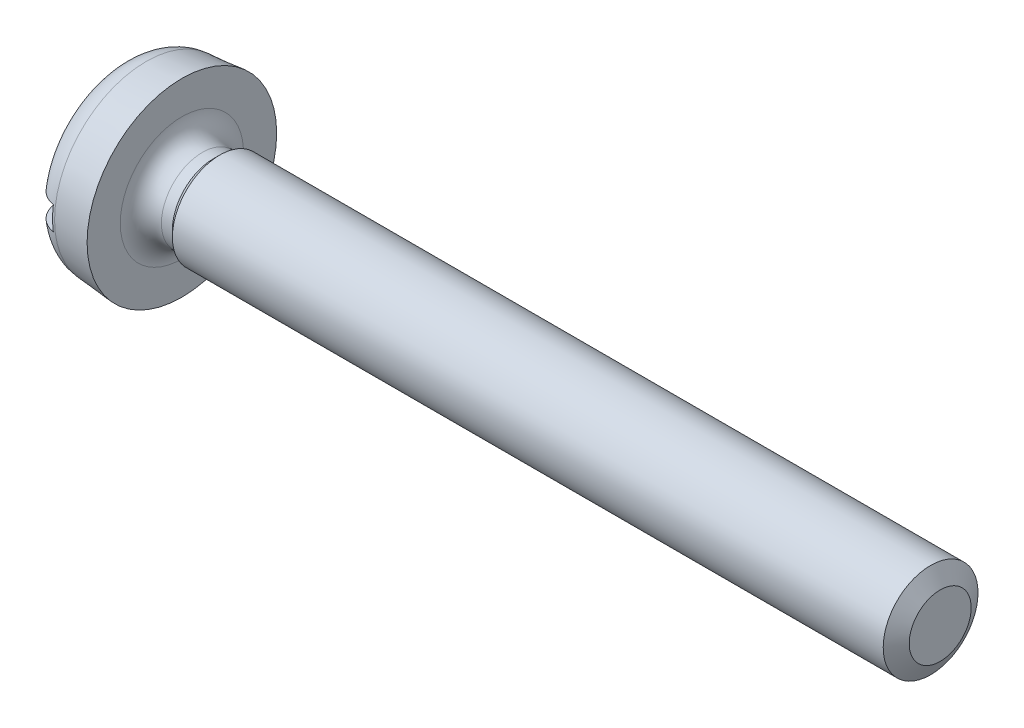
ISO-10303-21;
HEADER;
FILE_DESCRIPTION(('STEP AP214'),'2;1');
FILE_NAME('part.step','',(''),(''),'','','');
FILE_SCHEMA(('AUTOMOTIVE_DESIGN { 1 0 10303 214 1 1 1 1 }'));
ENDSEC;
DATA;
#1=APPLICATION_CONTEXT('core data for automotive mechanical design processes');
#2=APPLICATION_PROTOCOL_DEFINITION('international standard','automotive_design',2000,#1);
#3=PRODUCT_CONTEXT('',#1,'mechanical');
#4=PRODUCT('Part','Part','',(#3));
#5=PRODUCT_RELATED_PRODUCT_CATEGORY('part','',(#4));
#6=PRODUCT_DEFINITION_FORMATION('','',#4);
#7=PRODUCT_DEFINITION_CONTEXT('part definition',#1,'design');
#8=PRODUCT_DEFINITION('design','',#6,#7);
#9=PRODUCT_DEFINITION_SHAPE('','',#8);
#10=(LENGTH_UNIT() NAMED_UNIT(*) SI_UNIT(.MILLI.,.METRE.));
#11=(NAMED_UNIT(*) PLANE_ANGLE_UNIT() SI_UNIT($,.RADIAN.));
#12=(NAMED_UNIT(*) SI_UNIT($,.STERADIAN.) SOLID_ANGLE_UNIT());
#13=UNCERTAINTY_MEASURE_WITH_UNIT(LENGTH_MEASURE(1.E-05),#10,'distance_accuracy_value','');
#14=(GEOMETRIC_REPRESENTATION_CONTEXT(3) GLOBAL_UNCERTAINTY_ASSIGNED_CONTEXT((#13)) GLOBAL_UNIT_ASSIGNED_CONTEXT((#10,
#11,#12)) REPRESENTATION_CONTEXT('',''));
#15=CARTESIAN_POINT('',(0.,0.,0.));
#16=DIRECTION('',(0.,0.,1.));
#17=DIRECTION('',(1.,0.,0.));
#18=AXIS2_PLACEMENT_3D('',#15,#16,#17);
#19=CARTESIAN_POINT('',(0.,1.33646603300585,0.));
#20=DIRECTION('',(1.,0.,0.));
#21=DIRECTION('',(0.,0.,-1.));
#22=AXIS2_PLACEMENT_3D('',#19,#20,#21);
#23=PLANE('',#22);
#24=CARTESIAN_POINT('',(0.,0.,0.));
#25=DIRECTION('',(-1.,0.,0.));
#26=DIRECTION('',(0.,0.,1.));
#27=AXIS2_PLACEMENT_3D('',#24,#25,#26);
#28=CIRCLE('',#27,1.33646603300585);
#29=CARTESIAN_POINT('',(0.,0.25,1.31287526345877));
#30=VERTEX_POINT('',#29);
#31=CARTESIAN_POINT('',(0.,0.25,-1.31287526344982));
#32=VERTEX_POINT('',#31);
#33=EDGE_CURVE('E102',#30,#32,#28,.T.);
#34=ORIENTED_EDGE('',*,*,#33,.T.);
#35=DIRECTION('',(0.,0.,1.));
#36=VECTOR('',#35,1.);
#37=CARTESIAN_POINT('',(0.,0.25,-50.));
#38=LINE('',#37,#36);
#39=EDGE_CURVE('E155',#32,#30,#38,.T.);
#40=ORIENTED_EDGE('',*,*,#39,.T.);
#41=EDGE_LOOP('',(#34,#40));
#42=FACE_BOUND('',#41,.T.);
#43=ADVANCED_FACE('F41',(#42),#23,.F.);
#44=CARTESIAN_POINT('',(0.,-0.25,-1.31287526346165));
#45=VERTEX_POINT('',#44);
#46=CARTESIAN_POINT('',(0.,-0.25,1.3128752634498));
#47=VERTEX_POINT('',#46);
#48=EDGE_CURVE('E95',#45,#47,#28,.T.);
#49=ORIENTED_EDGE('',*,*,#48,.T.);
#50=DIRECTION('',(0.,0.,1.));
#51=VECTOR('',#50,1.);
#52=CARTESIAN_POINT('',(0.,-0.25,-50.));
#53=LINE('',#52,#51);
#54=EDGE_CURVE('E60',#45,#47,#53,.T.);
#55=ORIENTED_EDGE('',*,*,#54,.F.);
#56=EDGE_LOOP('',(#49,#55));
#57=FACE_BOUND('',#56,.T.);
#58=ADVANCED_FACE('F43',(#57),#23,.F.);
#59=CARTESIAN_POINT('',(0.6,0.,0.));
#60=DIRECTION('',(-1.,0.,0.));
#61=DIRECTION('',(0.,0.,1.));
#62=AXIS2_PLACEMENT_3D('',#59,#60,#61);
#63=TOROIDAL_SURFACE('',#62,1.33646603300585,0.6);
#64=CARTESIAN_POINT('',(0.5,0.,0.));
#65=DIRECTION('',(1.,0.,0.));
#66=DIRECTION('',(0.,1.,0.));
#67=AXIS2_PLACEMENT_3D('',#64,#65,#66);
#68=CIRCLE('',#67,1.92807401131581);
#69=CARTESIAN_POINT('',(0.5,-0.25,-1.91179742470569));
#70=VERTEX_POINT('',#69);
#71=CARTESIAN_POINT('',(0.5,0.25,-1.91179742470573));
#72=VERTEX_POINT('',#71);
#73=EDGE_CURVE('E53',#70,#72,#68,.T.);
#74=ORIENTED_EDGE('',*,*,#73,.T.);
#75=CARTESIAN_POINT('',(0.274780655200361,0.25,-1.82362420667529));
#76=CARTESIAN_POINT('',(0.246412102452132,0.25,-1.80515338183895));
#77=CARTESIAN_POINT('',(0.21959244724356,0.25,-1.78425531890812));
#78=CARTESIAN_POINT('',(0.169833030497775,0.25,-1.73822266295482));
#79=CARTESIAN_POINT('',(0.146898387228132,0.25,-1.71308256697066));
#80=CARTESIAN_POINT('',(0.1055857901035,0.25,-1.65933726560251));
#81=CARTESIAN_POINT('',(0.0872036369512324,0.25,-1.63073529005361));
#82=CARTESIAN_POINT('',(0.0554631702647639,0.25,-1.5708806163307));
#83=CARTESIAN_POINT('',(0.0421035983782345,0.25,-1.539628584507));
#84=CARTESIAN_POINT('',(0.0206432771902918,0.25,-1.47507749615836));
#85=CARTESIAN_POINT('',(0.0125876254984661,0.25,-1.44176345508562));
#86=CARTESIAN_POINT('',(0.00209404371654336,0.25,-1.3742617735636));
#87=CARTESIAN_POINT('',(-0.000343263952375891,0.25,-1.34007403674719));
#88=CARTESIAN_POINT('',(0.000426825088755068,0.25,-1.27125045227629));
#89=CARTESIAN_POINT('',(0.00371931456959661,0.25,-1.23661556247096));
#90=CARTESIAN_POINT('',(0.0159771202394861,0.25,-1.16836487965491));
#91=CARTESIAN_POINT('',(0.0249429593885406,0.25,-1.13474918089091));
#92=CARTESIAN_POINT('',(0.0484576079098382,0.25,-1.06892310437899));
#93=CARTESIAN_POINT('',(0.0630932921348853,0.25,-1.03674374367567));
#94=CARTESIAN_POINT('',(0.0975178908169316,0.25,-0.975266378936172));
#95=CARTESIAN_POINT('',(0.117307414846904,0.25,-0.945968716299352));
#96=CARTESIAN_POINT('',(0.16167877507065,0.25,-0.890885916345788));
#97=CARTESIAN_POINT('',(0.186295749588469,0.25,-0.865129042953103));
#98=CARTESIAN_POINT('',(0.239578542918412,0.25,-0.818201903765196));
#99=CARTESIAN_POINT('',(0.268244266621965,0.25,-0.797031530258771));
#100=CARTESIAN_POINT('',(0.32827251951993,0.25,-0.760396018098186));
#101=CARTESIAN_POINT('',(0.359573150112362,0.25,-0.744829720355561));
#102=CARTESIAN_POINT('',(0.424438831887223,0.25,-0.71950150134694));
#103=CARTESIAN_POINT('',(0.458002805134312,0.25,-0.709736838442938));
#104=CARTESIAN_POINT('',(0.524586152437568,0.25,-0.696826910772123));
#105=CARTESIAN_POINT('',(0.557544486769873,0.25,-0.693366517126957));
#106=CARTESIAN_POINT('',(0.623554751672406,0.25,-0.692262369608293));
#107=CARTESIAN_POINT('',(0.656606659486082,0.25,-0.694617305616999));
#108=CARTESIAN_POINT('',(0.720611933799709,0.25,-0.704833460708918));
#109=CARTESIAN_POINT('',(0.751597966403629,0.25,-0.712492488093254));
#110=CARTESIAN_POINT('',(0.811898810445142,0.25,-0.73277249226967));
#111=CARTESIAN_POINT('',(0.841213363360532,0.25,-0.745394234257519));
#112=CARTESIAN_POINT('',(0.898189202124164,0.25,-0.775523337992001));
#113=CARTESIAN_POINT('',(0.925787684286251,0.25,-0.793149196355944));
#114=CARTESIAN_POINT('',(0.977832434568892,0.25,-0.832561153237776));
#115=CARTESIAN_POINT('',(1.0022779916631,0.25,-0.854348187417311));
#116=CARTESIAN_POINT('',(1.04866939922734,0.25,-0.902723861616114));
#117=CARTESIAN_POINT('',(1.07041372154462,0.25,-0.929505970910619));
#118=CARTESIAN_POINT('',(1.10925507245311,0.25,-0.986252581526158));
#119=CARTESIAN_POINT('',(1.12635132905473,0.25,-1.01621761034512));
#120=CARTESIAN_POINT('',(1.15587826370585,0.25,-1.07945315539288));
#121=CARTESIAN_POINT('',(1.16815613299896,0.25,-1.11279518659324));
#122=CARTESIAN_POINT('',(1.18693723838892,0.25,-1.18106947273945));
#123=CARTESIAN_POINT('',(1.1934403543256,0.25,-1.21600176075921));
#124=CARTESIAN_POINT('',(1.20044092616513,0.25,-1.28644113223491));
#125=CARTESIAN_POINT('',(1.20094258611858,0.25,-1.32194779587658));
#126=CARTESIAN_POINT('',(1.19588430233747,0.25,-1.39252791212313));
#127=CARTESIAN_POINT('',(1.19032476970293,0.25,-1.42760139394539));
#128=CARTESIAN_POINT('',(1.17338401955317,0.25,-1.49576581682078));
#129=CARTESIAN_POINT('',(1.16208963405868,0.25,-1.52887833044069));
#130=CARTESIAN_POINT('',(1.13401256129969,0.25,-1.59268937671455));
#131=CARTESIAN_POINT('',(1.11723033304274,0.25,-1.62338811099264));
#132=CARTESIAN_POINT('',(1.07894820628702,0.25,-1.68097986318951));
#133=CARTESIAN_POINT('',(1.05752802949783,0.25,-1.70792588292095));
#134=CARTESIAN_POINT('',(1.01041587459132,0.25,-1.75778184073563));
#135=CARTESIAN_POINT('',(0.984724190633808,0.25,-1.78069205652325));
#136=CARTESIAN_POINT('',(0.930145997257693,0.25,-1.82153088343965));
#137=CARTESIAN_POINT('',(0.901303114330233,0.25,-1.83951781323058));
#138=CARTESIAN_POINT('',(0.840989444753481,0.25,-1.87034790500803));
#139=CARTESIAN_POINT('',(0.809518891529289,0.25,-1.88319152330656));
#140=CARTESIAN_POINT('',(0.745117220679504,0.25,-1.90327101630393));
#141=CARTESIAN_POINT('',(0.712199973113327,0.25,-1.91055140172039));
#142=CARTESIAN_POINT('',(0.645600086806312,0.25,-1.91946097417425));
#143=CARTESIAN_POINT('',(0.611917272957429,0.25,-1.92108885495025));
#144=CARTESIAN_POINT('',(0.544871876047508,0.25,-1.91864749728836));
#145=CARTESIAN_POINT('',(0.511508609397815,0.25,-1.91459667979622));
#146=CARTESIAN_POINT('',(0.445965972419364,0.25,-1.90095089068297));
#147=CARTESIAN_POINT('',(0.413785173235376,0.25,-1.89136286121128));
#148=CARTESIAN_POINT('',(0.363791372711458,0.25,-1.87176511786163));
#149=CARTESIAN_POINT('',(0.345312453158674,0.25,-1.86340950174438));
#150=CARTESIAN_POINT('',(0.309297583953017,0.25,-1.84486721881353));
#151=CARTESIAN_POINT('',(0.291761631921714,0.25,-1.83468055661862));
#152=CARTESIAN_POINT('',(0.274780655200361,0.25,-1.82362420667529));
#153=B_SPLINE_CURVE_WITH_KNOTS('',3,(#75,#76,#77,#78,#79,#80,#81,#82,#83,#84,#85,#86,#87,#88,
#89,#90,#91,#92,#93,#94,#95,#96,#97,#98,#99,#100,#101,#102,#103,#104,#105,#106,#107,#108,#109,
#110,#111,#112,#113,#114,#115,#116,#117,#118,#119,#120,#121,#122,#123,#124,#125,#126,#127,#128,
#129,#130,#131,#132,#133,#134,#135,#136,#137,#138,#139,#140,#141,#142,#143,#144,#145,#146,#147,
#148,#149,#150,#151,#152),.UNSPECIFIED.,.T.,.F.,(4,2,2,2,2,2,2,2,2,2,2,2,2,2,2,2,2,2,2,2,2,2,2,
2,2,2,2,2,2,2,2,2,2,2,2,2,2,2,4),(0.,0.101480580506103,0.203093832917956,0.304613003415434,
0.406106722427987,0.508452634187789,0.610809883665932,0.714700232898649,0.818600159967562,
0.92415939778676,1.02973112635202,1.13610190501634,1.24247018535583,1.34680873724124,
1.45109794328897,1.55001387342549,1.64890752112834,1.74422508190664,1.83955734536687,
1.93736831081815,2.03520129551269,2.13822665399301,2.24126911334704,2.34735670277911,
2.45344649961387,2.55946197564848,2.66547026163701,2.76991930669342,2.87435961778194,
2.97713002210324,3.07989335201045,3.18138079965786,3.28285924139421,3.38351701076899,
3.48419804002939,3.58455322803929,3.68478287038869,3.745527728868,3.80627243412446),.UNSPECIFIED.);
#154=EDGE_CURVE('E11',#72,#32,#153,.T.);
#155=ORIENTED_EDGE('',*,*,#154,.T.);
#156=ORIENTED_EDGE('',*,*,#33,.F.);
#157=CARTESIAN_POINT('',(0.256477971267522,0.25,0.806687931408381));
#158=CARTESIAN_POINT('',(0.228114615082312,0.25,0.827425620219491));
#159=CARTESIAN_POINT('',(0.201516055297734,0.25,0.850630894293794));
#160=CARTESIAN_POINT('',(0.152571331977694,0.25,0.901208782716569));
#161=CARTESIAN_POINT('',(0.130232677758374,0.25,0.92858860583429));
#162=CARTESIAN_POINT('',(0.090453419240616,0.25,0.986651718459012));
#163=CARTESIAN_POINT('',(0.0730064503192148,0.25,1.01733064284441));
#164=CARTESIAN_POINT('',(0.0434602329462491,0.25,1.08114792064194));
#165=CARTESIAN_POINT('',(0.0313588569417133,0.25,1.11428528944575));
#166=CARTESIAN_POINT('',(0.0127636490885262,0.25,1.18244291512941));
#167=CARTESIAN_POINT('',(0.00632467814466886,0.25,1.21747817526152));
#168=CARTESIAN_POINT('',(-0.000517283901222497,0.25,1.28813764188796));
#169=CARTESIAN_POINT('',(-0.000920002337641382,0.25,1.32376187491421));
#170=CARTESIAN_POINT('',(0.00434800778750708,0.25,1.39420239184286));
#171=CARTESIAN_POINT('',(0.00995817056286308,0.25,1.42902319077614));
#172=CARTESIAN_POINT('',(0.0270441493196882,0.25,1.49719541380208));
#173=CARTESIAN_POINT('',(0.038519433561569,0.25,1.53054697080046));
#174=CARTESIAN_POINT('',(0.066805333326314,0.25,1.59425150405688));
#175=CARTESIAN_POINT('',(0.0835255252196921,0.25,1.62464463268788));
#176=CARTESIAN_POINT('',(0.121902514595006,0.25,1.6821361772215));
#177=CARTESIAN_POINT('',(0.14355890782802,0.25,1.70923486264318));
#178=CARTESIAN_POINT('',(0.190851277951754,0.25,1.75895715118281));
#179=CARTESIAN_POINT('',(0.216425242565034,0.25,1.78163974924996));
#180=CARTESIAN_POINT('',(0.271051715066317,0.25,1.82233619463279));
#181=CARTESIAN_POINT('',(0.300104021127429,0.25,1.84035031264009));
#182=CARTESIAN_POINT('',(0.360541640657973,0.25,1.87101228101319));
#183=CARTESIAN_POINT('',(0.391900202395489,0.25,1.8837128776763));
#184=CARTESIAN_POINT('',(0.45631200146816,0.25,1.9036344892414));
#185=CARTESIAN_POINT('',(0.489365175345779,0.25,1.91085570916789));
#186=CARTESIAN_POINT('',(0.556022772858469,0.25,1.91957878374416));
#187=CARTESIAN_POINT('',(0.589622905521804,0.25,1.92111345806166));
#188=CARTESIAN_POINT('',(0.656602284044618,0.25,1.91850953421243));
#189=CARTESIAN_POINT('',(0.689981533445372,0.25,1.91437102722251));
#190=CARTESIAN_POINT('',(0.755513913993919,0.25,1.90055444905051));
#191=CARTESIAN_POINT('',(0.787669009716195,0.25,1.89088569056008));
#192=CARTESIAN_POINT('',(0.849904715559472,0.25,1.8662988413717));
#193=CARTESIAN_POINT('',(0.879985320055663,0.25,1.85138073644125));
#194=CARTESIAN_POINT('',(0.937296248504191,0.25,1.8166898208882));
#195=CARTESIAN_POINT('',(0.964519921503603,0.25,1.79690602558856));
#196=CARTESIAN_POINT('',(1.01528516641715,0.25,1.75307523190287));
#197=CARTESIAN_POINT('',(1.03882665732028,0.25,1.72902813974565));
#198=CARTESIAN_POINT('',(1.08172595916947,0.25,1.6771960618535));
#199=CARTESIAN_POINT('',(1.10105627962252,0.25,1.64938832937459));
#200=CARTESIAN_POINT('',(1.1348299586794,0.25,1.59094992813551));
#201=CARTESIAN_POINT('',(1.14927310957079,0.25,1.56031913946136));
#202=CARTESIAN_POINT('',(1.17303442993066,0.25,1.49675978182126));
#203=CARTESIAN_POINT('',(1.18229654757927,0.25,1.46381026645168));
#204=CARTESIAN_POINT('',(1.19524406921989,0.25,1.39683436474366));
#205=CARTESIAN_POINT('',(1.19892909236176,0.25,1.36280790502452));
#206=CARTESIAN_POINT('',(1.20068010908779,0.25,1.29411335821482));
#207=CARTESIAN_POINT('',(1.19866316593094,0.25,1.25944316342796));
#208=CARTESIAN_POINT('',(1.18893397437426,0.25,1.19091174344462));
#209=CARTESIAN_POINT('',(1.18122120940792,0.25,1.1570505919096));
#210=CARTESIAN_POINT('',(1.1601769908767,0.25,1.09051812196974));
#211=CARTESIAN_POINT('',(1.14675676173025,0.25,1.05787487044026));
#212=CARTESIAN_POINT('',(1.11467775754884,0.25,0.995269036554553));
#213=CARTESIAN_POINT('',(1.09601835733878,0.25,0.965306774676056));
#214=CARTESIAN_POINT('',(1.05376852779922,0.25,0.908648094512258));
#215=CARTESIAN_POINT('',(1.03013402245569,0.25,0.88198449936561));
#216=CARTESIAN_POINT('',(0.978662413228474,0.25,0.833068820610387));
#217=CARTESIAN_POINT('',(0.95082523053779,0.25,0.81081681974444));
#218=CARTESIAN_POINT('',(0.892141273449017,0.25,0.771800498870378));
#219=CARTESIAN_POINT('',(0.861346635725296,0.25,0.754957957909253));
#220=CARTESIAN_POINT('',(0.797264463313659,0.25,0.72699103526381));
#221=CARTESIAN_POINT('',(0.763978152414701,0.25,0.715863867305714));
#222=CARTESIAN_POINT('',(0.697614354203183,0.25,0.700248790529697));
#223=CARTESIAN_POINT('',(0.664607567426842,0.25,0.695460442169756));
#224=CARTESIAN_POINT('',(0.598260395579766,0.25,0.691762050694233));
#225=CARTESIAN_POINT('',(0.564920014690452,0.25,0.692851933990095));
#226=CARTESIAN_POINT('',(0.500305713906349,0.25,0.70068692292818));
#227=CARTESIAN_POINT('',(0.469003002412093,0.25,0.707199303446532));
#228=CARTESIAN_POINT('',(0.40792696012838,0.25,0.725286338726907));
#229=CARTESIAN_POINT('',(0.378151979755177,0.25,0.73685539923538));
#230=CARTESIAN_POINT('',(0.333202955789931,0.25,0.758618287094635));
#231=CARTESIAN_POINT('',(0.317258156054094,0.25,0.767262590798238));
#232=CARTESIAN_POINT('',(0.286211704034724,0.25,0.785948392377956));
#233=CARTESIAN_POINT('',(0.271110004852101,0.25,0.795989812428056));
#234=CARTESIAN_POINT('',(0.256477971267522,0.25,0.806687931408381));
#235=B_SPLINE_CURVE_WITH_KNOTS('',3,(#157,#158,#159,#160,#161,#162,#163,#164,#165,#166,#167,
#168,#169,#170,#171,#172,#173,#174,#175,#176,#177,#178,#179,#180,#181,#182,#183,#184,#185,#186,
#187,#188,#189,#190,#191,#192,#193,#194,#195,#196,#197,#198,#199,#200,#201,#202,#203,#204,#205,
#206,#207,#208,#209,#210,#211,#212,#213,#214,#215,#216,#217,#218,#219,#220,#221,#222,#223,#224,
#225,#226,#227,#228,#229,#230,#231,#232,#233,#234),.UNSPECIFIED.,.T.,.F.,(4,2,2,2,2,2,2,2,2,2,2,
2,2,2,2,2,2,2,2,2,2,2,2,2,2,2,2,2,2,2,2,2,2,2,2,2,2,2,4),(0.,0.105339517541496,
0.210863043847172,0.316248628408819,0.421592231495567,0.527945567697214,0.634303708007107,
0.739600518645185,0.844887784629499,0.948451329469217,1.05200639604478,1.1540654205465,
1.25611852605422,1.35713304654448,1.45814378713888,1.55857063213837,1.65899586314173,
1.75925247843266,1.85950936555035,1.95999470219393,2.06048224928579,2.16160732902587,
2.2627367062024,2.36493999460763,2.46715026198411,2.57085482340577,2.67456879117567,
2.77995861689427,2.88536102382396,2.99173979455689,3.09812056031159,3.20288545926039,
3.30759923619073,3.40714743935949,3.50669439630456,3.60217675632204,3.69755374960456,
3.75189912320181,3.80624147071477),.UNSPECIFIED.);
#236=CARTESIAN_POINT('',(0.5,0.25,1.91179742470573));
#237=VERTEX_POINT('',#236);
#238=EDGE_CURVE('E68',#30,#237,#235,.T.);
#239=ORIENTED_EDGE('',*,*,#238,.T.);
#240=CARTESIAN_POINT('',(0.5,-0.25,1.911797424708));
#241=VERTEX_POINT('',#240);
#242=EDGE_CURVE('E116',#237,#241,#68,.T.);
#243=ORIENTED_EDGE('',*,*,#242,.T.);
#244=CARTESIAN_POINT('',(0.256477971267522,-0.25,0.806687931408381));
#245=CARTESIAN_POINT('',(0.283073772587689,-0.25,0.787245268924271));
#246=CARTESIAN_POINT('',(0.311256734673759,-0.25,0.769944535846656));
#247=CARTESIAN_POINT('',(0.370114008258178,-0.25,0.740229039319219));
#248=CARTESIAN_POINT('',(0.40078982444084,-0.25,0.72781725365753));
#249=CARTESIAN_POINT('',(0.463871915221719,-0.25,0.708374903085703));
#250=CARTESIAN_POINT('',(0.496281146765581,-0.25,0.701353868838662));
#251=CARTESIAN_POINT('',(0.561820079529307,-0.25,0.693064165401114));
#252=CARTESIAN_POINT('',(0.594949507008969,-0.25,0.691793347727695));
#253=CARTESIAN_POINT('',(0.659868599580711,-0.25,0.695008568960638));
#254=CARTESIAN_POINT('',(0.691667437306453,-0.25,0.699313344775925));
#255=CARTESIAN_POINT('',(0.754098929301162,-0.25,0.713169938820393));
#256=CARTESIAN_POINT('',(0.784731434429556,-0.25,0.722722425688249));
#257=CARTESIAN_POINT('',(0.844220886452173,-0.25,0.74676075098349));
#258=CARTESIAN_POINT('',(0.873064893626734,-0.25,0.761278483323794));
#259=CARTESIAN_POINT('',(0.928072070248525,-0.25,0.794719206207599));
#260=CARTESIAN_POINT('',(0.954234673131184,-0.249999999999999,0.813643124999448));
#261=CARTESIAN_POINT('',(1.00455764012357,-0.249999999999999,0.856403426025723));
#262=CARTESIAN_POINT('',(1.02854601727969,-0.249999999999999,0.880442281861912));
#263=CARTESIAN_POINT('',(1.07233969055911,-0.249999999999999,0.932069110637458));
#264=CARTESIAN_POINT('',(1.09214414470062,-0.249999999999999,0.959657796158262));
#265=CARTESIAN_POINT('',(1.1277806057224,-0.249999999999999,1.01880991735136));
#266=CARTESIAN_POINT('',(1.14342273788476,-0.249999999999999,1.05048797462788));
#267=CARTESIAN_POINT('',(1.16921417457241,-0.249999999999999,1.11600811372882));
#268=CARTESIAN_POINT('',(1.17936312023956,-0.249999999999999,1.14985033677213));
#269=CARTESIAN_POINT('',(1.19390640883483,-0.249999999999999,1.21901855241698));
#270=CARTESIAN_POINT('',(1.198256990977,-0.249999999999999,1.25435377468587));
#271=CARTESIAN_POINT('',(1.20088701701162,-0.249999999999999,1.32525082928572));
#272=CARTESIAN_POINT('',(1.19916675302152,-0.249999999999999,1.36081265063097));
#273=CARTESIAN_POINT('',(1.18971168250471,-0.249999999999999,1.4306918716698));
#274=CARTESIAN_POINT('',(1.18204966947663,-0.249999999999999,1.46501910735443));
#275=CARTESIAN_POINT('',(1.16097413489613,-0.249999999999999,1.53186104297245));
#276=CARTESIAN_POINT('',(1.14756110125118,-0.249999999999999,1.56437589640111));
#277=CARTESIAN_POINT('',(1.11560510746244,-0.249999999999999,1.62610187095566));
#278=CARTESIAN_POINT('',(1.097149951566,-0.249999999999999,1.65535845455429));
#279=CARTESIAN_POINT('',(1.05552533497899,-0.249999999999999,1.71030063892363));
#280=CARTESIAN_POINT('',(1.03235623843943,-0.249999999999999,1.73598651527295));
#281=CARTESIAN_POINT('',(0.982310027591303,-0.249999999999999,1.7826880723843));
#282=CARTESIAN_POINT('',(0.955488368089887,-0.25,1.80376319341113));
#283=CARTESIAN_POINT('',(0.89865976512952,-0.25,1.8410604546949));
#284=CARTESIAN_POINT('',(0.868652997996467,-0.25,1.85728286340583));
#285=CARTESIAN_POINT('',(0.80661134227896,-0.25,1.88426128245479));
#286=CARTESIAN_POINT('',(0.774598152543606,-0.25,1.89506720989169));
#287=CARTESIAN_POINT('',(0.709207275735752,-0.25,1.91112053581599));
#288=CARTESIAN_POINT('',(0.675829634003418,-0.25,1.91636811884915));
#289=CARTESIAN_POINT('',(0.608837656027685,-0.25,1.92113717337633));
#290=CARTESIAN_POINT('',(0.57522536331111,-0.25,1.92068739829934));
#291=CARTESIAN_POINT('',(0.508554909070376,-0.25,1.91414489858889));
#292=CARTESIAN_POINT('',(0.475496740593513,-0.25,1.90805224481175));
#293=CARTESIAN_POINT('',(0.410905076842547,-0.25,1.89041194259857));
#294=CARTESIAN_POINT('',(0.379370111612105,-0.25,1.87886967409415));
#295=CARTESIAN_POINT('',(0.318677746934264,-0.25,1.85066978427311));
#296=CARTESIAN_POINT('',(0.289520360090014,-0.25,1.83401213584295));
#297=CARTESIAN_POINT('',(0.234312878154214,-0.25,1.79600861494104));
#298=CARTESIAN_POINT('',(0.208272281197349,-0.25,1.77464894819559));
#299=CARTESIAN_POINT('',(0.160116194508202,-0.25,1.72788872147727));
#300=CARTESIAN_POINT('',(0.138000808406379,-0.25,1.70248805485053));
#301=CARTESIAN_POINT('',(0.0981483460954297,-0.25,1.64818018628309));
#302=CARTESIAN_POINT('',(0.0804433545930301,-0.25,1.61924944626991));
#303=CARTESIAN_POINT('',(0.0500800334875067,-0.25,1.5588521395498));
#304=CARTESIAN_POINT('',(0.0374219573508644,-0.25,1.52738544557741));
#305=CARTESIAN_POINT('',(0.0173499908938401,-0.25,1.4624295127481));
#306=CARTESIAN_POINT('',(0.00999744820991954,-0.25,1.42892132543474));
#307=CARTESIAN_POINT('',(0.000932027792608463,-0.25,1.36115298475673));
#308=CARTESIAN_POINT('',(-0.000780662751594796,-0.25,1.32689280647117));
#309=CARTESIAN_POINT('',(0.00145026647964917,-0.25,1.25804055944598));
#310=CARTESIAN_POINT('',(0.00547954732126211,-0.25,1.22345127364072));
#311=CARTESIAN_POINT('',(0.0191955913899651,-0.25,1.15540432623591));
#312=CARTESIAN_POINT('',(0.0288841889000259,-0.25,1.12194703525683));
#313=CARTESIAN_POINT('',(0.053824335784651,-0.25,1.05655247440412));
#314=CARTESIAN_POINT('',(0.0691636585180387,-0.25,1.0246487067987));
#315=CARTESIAN_POINT('',(0.104937128864069,-0.25,0.963866007236648));
#316=CARTESIAN_POINT('',(0.125366421619973,-0.25,0.934984229941667));
#317=CARTESIAN_POINT('',(0.164028944144068,-0.25,0.8890583442293));
#318=CARTESIAN_POINT('',(0.181121312132097,-0.25,0.871041303852895));
#319=CARTESIAN_POINT('',(0.217335307543653,-0.25,0.837174222613305));
#320=CARTESIAN_POINT('',(0.236456923370609,-0.25,0.821324169367593));
#321=CARTESIAN_POINT('',(0.256477971267522,-0.25,0.806687931408381));
#322=B_SPLINE_CURVE_WITH_KNOTS('',3,(#244,#245,#246,#247,#248,#249,#250,#251,#252,#253,#254,
#255,#256,#257,#258,#259,#260,#261,#262,#263,#264,#265,#266,#267,#268,#269,#270,#271,#272,#273,
#274,#275,#276,#277,#278,#279,#280,#281,#282,#283,#284,#285,#286,#287,#288,#289,#290,#291,#292,
#293,#294,#295,#296,#297,#298,#299,#300,#301,#302,#303,#304,#305,#306,#307,#308,#309,#310,#311,
#312,#313,#314,#315,#316,#317,#318,#319,#320,#321),.UNSPECIFIED.,.T.,.F.,(4,2,2,2,2,2,2,2,2,2,2,
2,2,2,2,2,2,2,2,2,2,2,2,2,2,2,2,2,2,2,2,2,2,2,2,2,2,2,4),(0.,0.0987501477700192,
0.197560350182619,0.296544845923676,0.395492354524279,0.49130239439612,0.587124644765226,
0.683574337281439,0.780044367203687,0.881471955879883,0.982919936662499,1.08841286316154,
1.19391268045661,1.30020428911123,1.40649078328765,1.51149532344498,1.61649095694569,
1.71976342015201,1.82302790860739,1.92487039176505,2.02670723991341,2.12758748528433,
2.22846438116773,2.32883237519779,2.42919910894713,2.52946696584731,2.62973535421626,
2.73030191514127,2.83087113075401,2.93215189853696,3.03343775220811,3.13587677944123,
3.23831920663671,3.34230600671742,3.44632652944514,3.5520360732953,3.65764517390562,
3.73198370247417,3.80632180624214),.UNSPECIFIED.);
#323=EDGE_CURVE('E101',#241,#47,#322,.T.);
#324=ORIENTED_EDGE('',*,*,#323,.T.);
#325=ORIENTED_EDGE('',*,*,#48,.F.);
#326=CARTESIAN_POINT('',(0.274780655200361,-0.25,-1.82362420667529));
#327=CARTESIAN_POINT('',(0.302850124065662,-0.25,-1.84189666141676));
#328=CARTESIAN_POINT('',(0.332476912836235,-0.25,-1.85782010480749));
#329=CARTESIAN_POINT('',(0.394006386294874,-0.25,-1.88448283873071));
#330=CARTESIAN_POINT('',(0.425911622330593,-0.25,-1.89521620967586));
#331=CARTESIAN_POINT('',(0.49106542171139,-0.25,-1.91116335358416));
#332=CARTESIAN_POINT('',(0.524313546486278,-0.25,-1.91637891370102));
#333=CARTESIAN_POINT('',(0.591204792683811,-0.25,-1.92113959303416));
#334=CARTESIAN_POINT('',(0.624847818162146,-0.25,-1.92068606223463));
#335=CARTESIAN_POINT('',(0.691513871966761,-0.25,-1.91413229696865));
#336=CARTESIAN_POINT('',(0.724537965843794,-0.25,-1.90804289638477));
#337=CARTESIAN_POINT('',(0.789097481854443,-0.25,-1.890411113723));
#338=CARTESIAN_POINT('',(0.820632856008674,-0.25,-1.87886855602916));
#339=CARTESIAN_POINT('',(0.88135550474487,-0.25,-1.85065407323916));
#340=CARTESIAN_POINT('',(0.910540461536868,-0.25,-1.83397716134261));
#341=CARTESIAN_POINT('',(0.965713973197686,-0.25,-1.79598321604751));
#342=CARTESIAN_POINT('',(0.991702483157431,-0.249999999999999,-1.77466611746744));
#343=CARTESIAN_POINT('',(1.03989067692429,-0.249999999999999,-1.72788939986325));
#344=CARTESIAN_POINT('',(1.06207077173726,-0.249999999999999,-1.70240960587084));
#345=CARTESIAN_POINT('',(1.10188385808005,-0.249999999999999,-1.64811708765422));
#346=CARTESIAN_POINT('',(1.11951669564412,-0.249999999999999,-1.61930425062421));
#347=CARTESIAN_POINT('',(1.14991644324992,-0.249999999999999,-1.55888388907362));
#348=CARTESIAN_POINT('',(1.16263701266532,-0.249999999999999,-1.52725305653232));
#349=CARTESIAN_POINT('',(1.18266472006596,-0.249999999999999,-1.46232290586993));
#350=CARTESIAN_POINT('',(1.18997153304379,-0.249999999999999,-1.42902348770568));
#351=CARTESIAN_POINT('',(1.1990757467124,-0.249999999999999,-1.36122512528322));
#352=CARTESIAN_POINT('',(1.2007978533932,-0.249999999999999,-1.32671607825361));
#353=CARTESIAN_POINT('',(1.19852158611445,-0.249999999999999,-1.2578879596417));
#354=CARTESIAN_POINT('',(1.19452272743365,-0.249999999999999,-1.22356890440419));
#355=CARTESIAN_POINT('',(1.18084584012593,-0.249999999999999,-1.15550299104831));
#356=CARTESIAN_POINT('',(1.1710768980116,-0.249999999999999,-1.12177439719897));
#357=CARTESIAN_POINT('',(1.14608963326822,-0.249999999999999,-1.05639845281472));
#358=CARTESIAN_POINT('',(1.13087072283895,-0.249999999999999,-1.02475132721021));
#359=CARTESIAN_POINT('',(1.09517672424942,-0.249999999999999,-0.964015185217598));
#360=CARTESIAN_POINT('',(1.07463585116154,-0.249999999999999,-0.934964791126678));
#361=CARTESIAN_POINT('',(1.0289468611237,-0.249999999999999,-0.8807368430404));
#362=CARTESIAN_POINT('',(1.00379831827947,-0.249999999999999,-0.855559647447035));
#363=CARTESIAN_POINT('',(0.949690395648163,-0.249999999999999,-0.809995267822464));
#364=CARTESIAN_POINT('',(0.920750663668052,-0.25,-0.78958480236971));
#365=CARTESIAN_POINT('',(0.859743350231913,-0.25,-0.754142685467505));
#366=CARTESIAN_POINT('',(0.827676707896818,-0.25,-0.739109425347762));
#367=CARTESIAN_POINT('',(0.762667368563303,-0.25,-0.715550940340575));
#368=CARTESIAN_POINT('',(0.729809776019388,-0.25,-0.706791374099588));
#369=CARTESIAN_POINT('',(0.663065073704783,-0.25,-0.695254567880974));
#370=CARTESIAN_POINT('',(0.629178416423444,-0.25,-0.692474736103956));
#371=CARTESIAN_POINT('',(0.563211392329523,-0.25,-0.693020234763523));
#372=CARTESIAN_POINT('',(0.531128042957495,-0.25,-0.6960379514122));
#373=CARTESIAN_POINT('',(0.467930020079841,-0.25,-0.707432616918492));
#374=CARTESIAN_POINT('',(0.436815388934093,-0.25,-0.715809799789364));
#375=CARTESIAN_POINT('',(0.376446381647119,-0.25,-0.737546549416808));
#376=CARTESIAN_POINT('',(0.347188974627552,-0.25,-0.750897740765065));
#377=CARTESIAN_POINT('',(0.29118144985243,-0.25,-0.782096393740088));
#378=CARTESIAN_POINT('',(0.2644318554737,-0.25,-0.799944791073738));
#379=CARTESIAN_POINT('',(0.21280112205241,-0.25,-0.840563479123872));
#380=CARTESIAN_POINT('',(0.18807630516109,-0.25,-0.863532471122668));
#381=CARTESIAN_POINT('',(0.142632089074549,-0.25,-0.91314015549835));
#382=CARTESIAN_POINT('',(0.121913544381091,-0.25,-0.939779628685349));
#383=CARTESIAN_POINT('',(0.0841798141603359,-0.25,-0.997238681509961));
#384=CARTESIAN_POINT('',(0.0673637911083439,-0.25,-1.02818930073671));
#385=CARTESIAN_POINT('',(0.039099170350345,-0.25,-1.09245311591646));
#386=CARTESIAN_POINT('',(0.027651023435435,-0.25,-1.12576651002354));
#387=CARTESIAN_POINT('',(0.0103722361801811,-0.25,-1.19421384118874));
#388=CARTESIAN_POINT('',(0.00460478662294688,-0.25,-1.2293637757047));
#389=CARTESIAN_POINT('',(-0.000878679151094517,-0.25,-1.30013265464534));
#390=CARTESIAN_POINT('',(-0.000595165424059978,-0.25,-1.335751562424));
#391=CARTESIAN_POINT('',(0.00602927957051828,-0.25,-1.40603493785939));
#392=CARTESIAN_POINT('',(0.0123048116822738,-0.25,-1.44070555722832));
#393=CARTESIAN_POINT('',(0.0306887868415261,-0.25,-1.50847558350848));
#394=CARTESIAN_POINT('',(0.0427982176917192,-0.25,-1.54157472329189));
#395=CARTESIAN_POINT('',(0.0722935157774218,-0.25,-1.60468559872415));
#396=CARTESIAN_POINT('',(0.0895922457386431,-0.25,-1.63473812116026));
#397=CARTESIAN_POINT('',(0.129048154505429,-0.25,-1.6914266708082));
#398=CARTESIAN_POINT('',(0.151198946684604,-0.25,-1.71806711686357));
#399=CARTESIAN_POINT('',(0.190498702041562,-0.25,-1.75782741941759));
#400=CARTESIAN_POINT('',(0.206359023192159,-0.25,-1.77224346176931));
#401=CARTESIAN_POINT('',(0.23952762918078,-0.25,-1.79930107726038));
#402=CARTESIAN_POINT('',(0.256835902453732,-0.25,-1.81194266457049));
#403=CARTESIAN_POINT('',(0.274780655200361,-0.25,-1.82362420667529));
#404=B_SPLINE_CURVE_WITH_KNOTS('',3,(#326,#327,#328,#329,#330,#331,#332,#333,#334,#335,#336,
#337,#338,#339,#340,#341,#342,#343,#344,#345,#346,#347,#348,#349,#350,#351,#352,#353,#354,#355,
#356,#357,#358,#359,#360,#361,#362,#363,#364,#365,#366,#367,#368,#369,#370,#371,#372,#373,#374,
#375,#376,#377,#378,#379,#380,#381,#382,#383,#384,#385,#386,#387,#388,#389,#390,#391,#392,#393,
#394,#395,#396,#397,#398,#399,#400,#401,#402,#403),.UNSPECIFIED.,.T.,.F.,(4,2,2,2,2,2,2,2,2,2,2,
2,2,2,2,2,2,2,2,2,2,2,2,2,2,2,2,2,2,2,2,2,2,2,2,2,2,2,4),(0.,0.100401062182578,
0.200916369230917,0.301399110583017,0.401857924372673,0.502124025494567,0.602393355851686,
0.70276038283154,0.80312881977564,0.903998978686786,1.00487255251616,1.10667574998262,
1.20848505856888,1.31166139334771,1.41484647048427,1.5197024094854,1.62456966101414,
1.73080076101002,1.83704168507411,1.94275232230141,2.04843130812937,2.14992147627128,
2.25136764660652,2.34757938832311,2.44379533127149,2.53984998938428,2.63592464954519,
2.73671855873459,2.83753394270023,2.9427139364961,3.04790276166498,3.1542488966228,
3.26058677033834,3.36577714242786,3.4709853317399,3.57451735589247,3.67791391414109,
3.74210061585798,3.8062868049523),.UNSPECIFIED.);
#405=EDGE_CURVE('E86',#45,#70,#404,.T.);
#406=ORIENTED_EDGE('',*,*,#405,.T.);
#407=EDGE_LOOP('',(#74,#155,#156,#239,#243,#324,#325,#406));
#408=FACE_BOUND('',#407,.T.);
#409=CARTESIAN_POINT('',(0.547706554351409,0.,0.));
#410=DIRECTION('',(-1.,0.,0.));
#411=DIRECTION('',(0.,0.,1.));
#412=AXIS2_PLACEMENT_3D('',#409,#410,#411);
#413=CIRCLE('',#412,1.9341828518609);
#414=CARTESIAN_POINT('',(0.547706554351409,0.,1.9341828518609));
#415=VERTEX_POINT('',#414);
#416=EDGE_CURVE('E103',#415,#415,#413,.T.);
#417=ORIENTED_EDGE('',*,*,#416,.T.);
#418=EDGE_LOOP('',(#417));
#419=FACE_BOUND('',#418,.T.);
#420=ADVANCED_FACE('F98',(#408,#419),#63,.T.);
#421=CARTESIAN_POINT('',(1.3,0.,0.));
#422=DIRECTION('',(1.,0.,0.));
#423=DIRECTION('',(0.,0.,-1.));
#424=AXIS2_PLACEMENT_3D('',#421,#422,#423);
#425=CONICAL_SURFACE('',#424,2.,0.08726646259971);
#426=ORIENTED_EDGE('',*,*,#416,.F.);
#427=EDGE_LOOP('',(#426));
#428=FACE_BOUND('',#427,.T.);
#429=CARTESIAN_POINT('',(1.3,0.,0.));
#430=DIRECTION('',(-1.,0.,0.));
#431=DIRECTION('',(0.,0.,1.));
#432=AXIS2_PLACEMENT_3D('',#429,#430,#431);
#433=CIRCLE('',#432,2.);
#434=CARTESIAN_POINT('',(1.3,0.,2.));
#435=VERTEX_POINT('',#434);
#436=EDGE_CURVE('E107',#435,#435,#433,.T.);
#437=ORIENTED_EDGE('',*,*,#436,.T.);
#438=EDGE_LOOP('',(#437));
#439=FACE_BOUND('',#438,.T.);
#440=ADVANCED_FACE('F181',(#428,#439),#425,.T.);
#441=CARTESIAN_POINT('',(1.3,1.3,0.));
#442=DIRECTION('',(-1.,0.,0.));
#443=DIRECTION('',(0.,0.,1.));
#444=AXIS2_PLACEMENT_3D('',#441,#442,#443);
#445=PLANE('',#444);
#446=ORIENTED_EDGE('',*,*,#436,.F.);
#447=EDGE_LOOP('',(#446));
#448=FACE_BOUND('',#447,.T.);
#449=CARTESIAN_POINT('',(1.3,0.,0.));
#450=DIRECTION('',(-1.,0.,0.));
#451=DIRECTION('',(0.,0.,1.));
#452=AXIS2_PLACEMENT_3D('',#449,#450,#451);
#453=CIRCLE('',#452,1.3);
#454=CARTESIAN_POINT('',(1.3,0.,1.3));
#455=VERTEX_POINT('',#454);
#456=EDGE_CURVE('E173',#455,#455,#453,.T.);
#457=ORIENTED_EDGE('',*,*,#456,.T.);
#458=EDGE_LOOP('',(#457));
#459=FACE_BOUND('',#458,.T.);
#460=ADVANCED_FACE('F183',(#448,#459),#445,.F.);
#461=CARTESIAN_POINT('',(1.734,0.,0.));
#462=DIRECTION('',(-1.,0.,0.));
#463=DIRECTION('',(0.,0.,1.));
#464=AXIS2_PLACEMENT_3D('',#461,#462,#463);
#465=TOROIDAL_SURFACE('',#464,1.3,0.434);
#466=ORIENTED_EDGE('',*,*,#456,.F.);
#467=EDGE_LOOP('',(#466));
#468=FACE_BOUND('',#467,.T.);
#469=CARTESIAN_POINT('',(1.734,0.,0.));
#470=DIRECTION('',(-1.,0.,0.));
#471=DIRECTION('',(0.,0.,1.));
#472=AXIS2_PLACEMENT_3D('',#469,#470,#471);
#473=CIRCLE('',#472,0.866);
#474=CARTESIAN_POINT('',(1.734,0.,0.866));
#475=VERTEX_POINT('',#474);
#476=EDGE_CURVE('E170',#475,#475,#473,.T.);
#477=ORIENTED_EDGE('',*,*,#476,.T.);
#478=EDGE_LOOP('',(#477));
#479=FACE_BOUND('',#478,.T.);
#480=ADVANCED_FACE('F186',(#468,#479),#465,.F.);
#481=CARTESIAN_POINT('',(-2.4770215242466,0.,0.));
#482=DIRECTION('',(-1.,0.,0.));
#483=DIRECTION('',(0.,0.,1.));
#484=AXIS2_PLACEMENT_3D('',#481,#482,#483);
#485=CYLINDRICAL_SURFACE('',#484,0.866);
#486=ORIENTED_EDGE('',*,*,#476,.F.);
#487=EDGE_LOOP('',(#486));
#488=FACE_BOUND('',#487,.T.);
#489=CARTESIAN_POINT('',(1.966,0.,0.));
#490=DIRECTION('',(-1.,0.,0.));
#491=DIRECTION('',(0.,0.,1.));
#492=AXIS2_PLACEMENT_3D('',#489,#490,#491);
#493=CIRCLE('',#492,0.866);
#494=CARTESIAN_POINT('',(1.966,0.,0.866));
#495=VERTEX_POINT('',#494);
#496=EDGE_CURVE('E167',#495,#495,#493,.T.);
#497=ORIENTED_EDGE('',*,*,#496,.T.);
#498=EDGE_LOOP('',(#497));
#499=FACE_BOUND('',#498,.T.);
#500=ADVANCED_FACE('F192',(#488,#499),#485,.T.);
#501=CARTESIAN_POINT('',(2.1,0.,0.));
#502=DIRECTION('',(1.,0.,0.));
#503=DIRECTION('',(0.,0.,-1.));
#504=AXIS2_PLACEMENT_3D('',#501,#502,#503);
#505=CONICAL_SURFACE('',#504,0.999999999999998,0.785398163397445);
#506=ORIENTED_EDGE('',*,*,#496,.F.);
#507=EDGE_LOOP('',(#506));
#508=FACE_BOUND('',#507,.T.);
#509=CARTESIAN_POINT('',(2.1,0.,0.));
#510=DIRECTION('',(-1.,0.,0.));
#511=DIRECTION('',(0.,0.,1.));
#512=AXIS2_PLACEMENT_3D('',#509,#510,#511);
#513=CIRCLE('',#512,0.999999999999998);
#514=CARTESIAN_POINT('',(2.1,0.,0.999999999999998));
#515=VERTEX_POINT('',#514);
#516=EDGE_CURVE('E160',#515,#515,#513,.T.);
#517=ORIENTED_EDGE('',*,*,#516,.T.);
#518=EDGE_LOOP('',(#517));
#519=FACE_BOUND('',#518,.T.);
#520=ADVANCED_FACE('F198',(#508,#519),#505,.T.);
#521=CARTESIAN_POINT('',(-2.4770215242466,0.,0.));
#522=DIRECTION('',(-1.,0.,0.));
#523=DIRECTION('',(0.,0.,1.));
#524=AXIS2_PLACEMENT_3D('',#521,#522,#523);
#525=CYLINDRICAL_SURFACE('',#524,0.999999999999999);
#526=CARTESIAN_POINT('',(17.0978335977023,0.,0.));
#527=DIRECTION('',(1.,0.,0.));
#528=DIRECTION('',(0.,0.,-1.));
#529=AXIS2_PLACEMENT_3D('',#526,#527,#528);
#530=CIRCLE('',#529,0.999999999999999);
#531=CARTESIAN_POINT('',(17.0978335977023,0.,-0.999999999999999));
#532=VERTEX_POINT('',#531);
#533=EDGE_CURVE('E303',#532,#532,#530,.T.);
#534=ORIENTED_EDGE('',*,*,#533,.F.);
#535=EDGE_LOOP('',(#534));
#536=FACE_BOUND('',#535,.T.);
#537=ORIENTED_EDGE('',*,*,#516,.F.);
#538=EDGE_LOOP('',(#537));
#539=FACE_BOUND('',#538,.T.);
#540=ADVANCED_FACE('F139',(#536,#539),#525,.T.);
#541=CARTESIAN_POINT('',(0.,0.25,-50.));
#542=DIRECTION('',(0.,1.,0.));
#543=DIRECTION('',(-1.,0.,0.));
#544=AXIS2_PLACEMENT_3D('',#541,#542,#543);
#545=PLANE('',#544);
#546=DIRECTION('',(0.,0.,1.));
#547=VECTOR('',#546,1.);
#548=CARTESIAN_POINT('',(0.5,0.25,-50.));
#549=LINE('',#548,#547);
#550=EDGE_CURVE('E157',#72,#237,#549,.T.);
#551=ORIENTED_EDGE('',*,*,#550,.T.);
#552=ORIENTED_EDGE('',*,*,#238,.F.);
#553=ORIENTED_EDGE('',*,*,#39,.F.);
#554=ORIENTED_EDGE('',*,*,#154,.F.);
#555=EDGE_LOOP('',(#551,#552,#553,#554));
#556=FACE_BOUND('',#555,.T.);
#557=ADVANCED_FACE('F135',(#556),#545,.F.);
#558=CARTESIAN_POINT('',(0.5,0.25,-50.));
#559=DIRECTION('',(1.,0.,0.));
#560=DIRECTION('',(0.,1.,0.));
#561=AXIS2_PLACEMENT_3D('',#558,#559,#560);
#562=PLANE('',#561);
#563=ORIENTED_EDGE('',*,*,#550,.F.);
#564=ORIENTED_EDGE('',*,*,#73,.F.);
#565=DIRECTION('',(0.,0.,1.));
#566=VECTOR('',#565,1.);
#567=CARTESIAN_POINT('',(0.5,-0.25,-50.));
#568=LINE('',#567,#566);
#569=EDGE_CURVE('E89',#70,#241,#568,.T.);
#570=ORIENTED_EDGE('',*,*,#569,.T.);
#571=ORIENTED_EDGE('',*,*,#242,.F.);
#572=EDGE_LOOP('',(#563,#564,#570,#571));
#573=FACE_BOUND('',#572,.T.);
#574=ADVANCED_FACE('F125',(#573),#562,.F.);
#575=CARTESIAN_POINT('',(0.,-0.25,-50.));
#576=DIRECTION('',(0.,-1.,0.));
#577=DIRECTION('',(1.,0.,0.));
#578=AXIS2_PLACEMENT_3D('',#575,#576,#577);
#579=PLANE('',#578);
#580=ORIENTED_EDGE('',*,*,#54,.T.);
#581=ORIENTED_EDGE('',*,*,#323,.F.);
#582=ORIENTED_EDGE('',*,*,#569,.F.);
#583=ORIENTED_EDGE('',*,*,#405,.F.);
#584=EDGE_LOOP('',(#580,#581,#582,#583));
#585=FACE_BOUND('',#584,.T.);
#586=ADVANCED_FACE('F87',(#585),#579,.F.);
#587=CARTESIAN_POINT('',(17.0978335977023,0.,0.));
#588=DIRECTION('',(-1.,0.,0.));
#589=DIRECTION('',(0.,0.,1.));
#590=AXIS2_PLACEMENT_3D('',#587,#588,#589);
#591=CONICAL_SURFACE('',#590,0.999999999999999,1.04250708384038);
#592=CARTESIAN_POINT('',(17.3,0.,0.));
#593=DIRECTION('',(1.,0.,0.));
#594=DIRECTION('',(0.,0.,-1.));
#595=AXIS2_PLACEMENT_3D('',#592,#593,#594);
#596=CIRCLE('',#595,0.653599999999999);
#597=CARTESIAN_POINT('',(17.3,0.,-0.653599999999999));
#598=VERTEX_POINT('',#597);
#599=EDGE_CURVE('E96',#598,#598,#596,.T.);
#600=ORIENTED_EDGE('',*,*,#599,.F.);
#601=EDGE_LOOP('',(#600));
#602=FACE_BOUND('',#601,.T.);
#603=ORIENTED_EDGE('',*,*,#533,.T.);
#604=EDGE_LOOP('',(#603));
#605=FACE_BOUND('',#604,.T.);
#606=ADVANCED_FACE('F124',(#602,#605),#591,.T.);
#607=CARTESIAN_POINT('',(17.3,0.,0.));
#608=DIRECTION('',(-1.,0.,0.));
#609=DIRECTION('',(0.,0.,1.));
#610=AXIS2_PLACEMENT_3D('',#607,#608,#609);
#611=PLANE('',#610);
#612=ORIENTED_EDGE('',*,*,#599,.T.);
#613=EDGE_LOOP('',(#612));
#614=FACE_BOUND('',#613,.T.);
#615=ADVANCED_FACE('F126',(#614),#611,.F.);
#616=CLOSED_SHELL('',(#43,#58,#420,#440,#460,#480,#500,#520,#540,#557,#574,#586,#606,#615));
#617=MANIFOLD_SOLID_BREP('B2',#616);
#618=ADVANCED_BREP_SHAPE_REPRESENTATION('',(#18,#617),#14);
#619=SHAPE_DEFINITION_REPRESENTATION(#9,#618);
ENDSEC;
END-ISO-10303-21;
